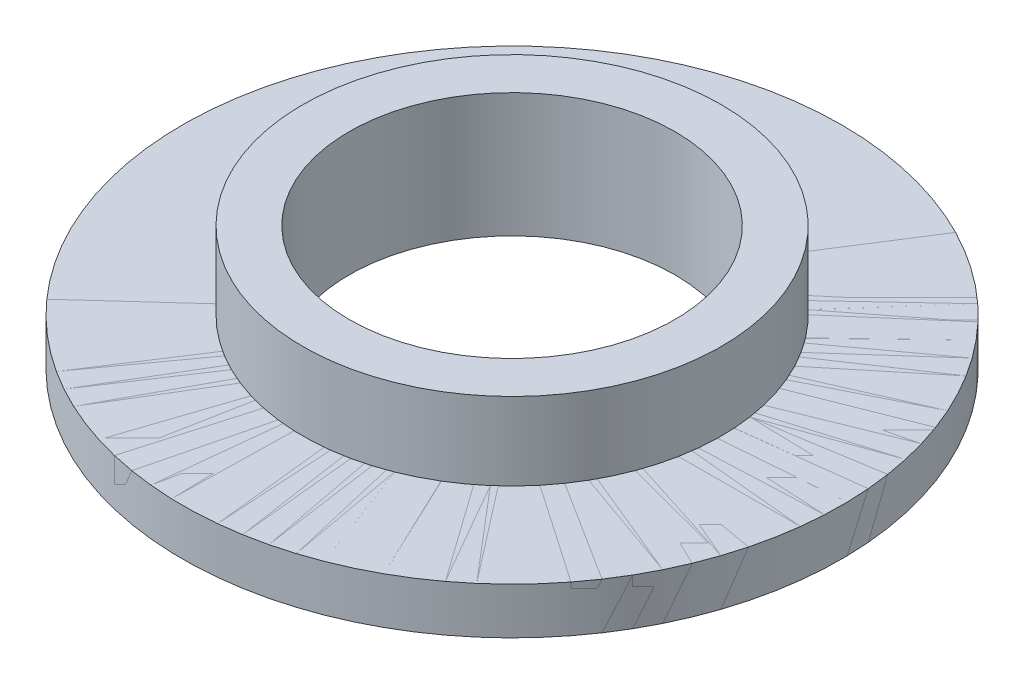
ISO-10303-21;
HEADER;
FILE_DESCRIPTION(('STEP AP214'),'2;1');
FILE_NAME('part.step','',(''),(''),'','','');
FILE_SCHEMA(('AUTOMOTIVE_DESIGN { 1 0 10303 214 1 1 1 1 }'));
ENDSEC;
DATA;
#1=APPLICATION_CONTEXT('core data for automotive mechanical design processes');
#2=APPLICATION_PROTOCOL_DEFINITION('international standard','automotive_design',2000,#1);
#3=PRODUCT_CONTEXT('',#1,'mechanical');
#4=PRODUCT('Part','Part','',(#3));
#5=PRODUCT_RELATED_PRODUCT_CATEGORY('part','',(#4));
#6=PRODUCT_DEFINITION_FORMATION('','',#4);
#7=PRODUCT_DEFINITION_CONTEXT('part definition',#1,'design');
#8=PRODUCT_DEFINITION('design','',#6,#7);
#9=PRODUCT_DEFINITION_SHAPE('','',#8);
#10=(LENGTH_UNIT() NAMED_UNIT(*) SI_UNIT(.MILLI.,.METRE.));
#11=(NAMED_UNIT(*) PLANE_ANGLE_UNIT() SI_UNIT($,.RADIAN.));
#12=(NAMED_UNIT(*) SI_UNIT($,.STERADIAN.) SOLID_ANGLE_UNIT());
#13=UNCERTAINTY_MEASURE_WITH_UNIT(LENGTH_MEASURE(1.E-05),#10,'distance_accuracy_value','');
#14=(GEOMETRIC_REPRESENTATION_CONTEXT(3) GLOBAL_UNCERTAINTY_ASSIGNED_CONTEXT((#13)) GLOBAL_UNIT_ASSIGNED_CONTEXT((#10,
#11,#12)) REPRESENTATION_CONTEXT('',''));
#15=CARTESIAN_POINT('',(0.,0.,0.));
#16=DIRECTION('',(0.,0.,1.));
#17=DIRECTION('',(1.,0.,0.));
#18=AXIS2_PLACEMENT_3D('',#15,#16,#17);
#19=CARTESIAN_POINT('',(0.,0.,0.));
#20=DIRECTION('',(0.,1.,0.));
#21=DIRECTION('',(0.,0.,1.));
#22=AXIS2_PLACEMENT_3D('',#19,#20,#21);
#23=PLANE('',#22);
#24=CARTESIAN_POINT('',(0.,0.,0.));
#25=DIRECTION('',(0.,-1.,0.));
#26=DIRECTION('',(0.,0.,-1.));
#27=AXIS2_PLACEMENT_3D('',#24,#25,#26);
#28=CIRCLE('',#27,2.667);
#29=CARTESIAN_POINT('',(0.,0.,-2.667));
#30=VERTEX_POINT('',#29);
#31=EDGE_CURVE('E11',#30,#30,#28,.T.);
#32=ORIENTED_EDGE('',*,*,#31,.F.);
#33=EDGE_LOOP('',(#32));
#34=FACE_BOUND('',#33,.T.);
#35=CARTESIAN_POINT('',(0.,0.,0.));
#36=DIRECTION('',(0.,-1.,0.));
#37=DIRECTION('',(0.,0.,-1.));
#38=AXIS2_PLACEMENT_3D('',#35,#36,#37);
#39=CIRCLE('',#38,5.3975);
#40=CARTESIAN_POINT('',(0.,0.,-5.3975));
#41=VERTEX_POINT('',#40);
#42=EDGE_CURVE('E78',#41,#41,#39,.T.);
#43=ORIENTED_EDGE('',*,*,#42,.T.);
#44=EDGE_LOOP('',(#43));
#45=FACE_BOUND('',#44,.T.);
#46=ADVANCED_FACE('F61',(#34,#45),#23,.F.);
#47=CARTESIAN_POINT('',(0.,0.,0.));
#48=DIRECTION('',(0.,-1.,0.));
#49=DIRECTION('',(0.,0.,-1.));
#50=AXIS2_PLACEMENT_3D('',#47,#48,#49);
#51=CYLINDRICAL_SURFACE('',#50,2.667);
#52=CARTESIAN_POINT('',(0.,0.762,0.));
#53=DIRECTION('',(0.,-1.,0.));
#54=DIRECTION('',(0.,0.,-1.));
#55=AXIS2_PLACEMENT_3D('',#52,#53,#54);
#56=CIRCLE('',#55,2.667);
#57=CARTESIAN_POINT('',(0.,0.762,-2.667));
#58=VERTEX_POINT('',#57);
#59=EDGE_CURVE('E68',#58,#58,#56,.T.);
#60=ORIENTED_EDGE('',*,*,#59,.F.);
#61=EDGE_LOOP('',(#60));
#62=FACE_BOUND('',#61,.T.);
#63=ORIENTED_EDGE('',*,*,#31,.T.);
#64=EDGE_LOOP('',(#63));
#65=FACE_BOUND('',#64,.T.);
#66=ADVANCED_FACE('F94',(#62,#65),#51,.F.);
#67=CARTESIAN_POINT('',(0.,0.762,0.));
#68=DIRECTION('',(0.,1.,0.));
#69=DIRECTION('',(0.,0.,1.));
#70=AXIS2_PLACEMENT_3D('',#67,#68,#69);
#71=PLANE('',#70);
#72=ORIENTED_EDGE('',*,*,#59,.T.);
#73=EDGE_LOOP('',(#72));
#74=FACE_BOUND('',#73,.T.);
#75=CARTESIAN_POINT('',(0.,0.762,0.));
#76=DIRECTION('',(0.,-1.,0.));
#77=DIRECTION('',(0.,0.,-1.));
#78=AXIS2_PLACEMENT_3D('',#75,#76,#77);
#79=CIRCLE('',#78,5.3975);
#80=CARTESIAN_POINT('',(0.,0.762,-5.3975));
#81=VERTEX_POINT('',#80);
#82=EDGE_CURVE('E73',#81,#81,#79,.T.);
#83=ORIENTED_EDGE('',*,*,#82,.F.);
#84=EDGE_LOOP('',(#83));
#85=FACE_BOUND('',#84,.T.);
#86=ADVANCED_FACE('F88',(#74,#85),#71,.T.);
#87=CARTESIAN_POINT('',(0.,0.,0.));
#88=DIRECTION('',(0.,-1.,0.));
#89=DIRECTION('',(0.,0.,-1.));
#90=AXIS2_PLACEMENT_3D('',#87,#88,#89);
#91=CYLINDRICAL_SURFACE('',#90,5.3975);
#92=ORIENTED_EDGE('',*,*,#82,.T.);
#93=EDGE_LOOP('',(#92));
#94=FACE_BOUND('',#93,.T.);
#95=ORIENTED_EDGE('',*,*,#42,.F.);
#96=EDGE_LOOP('',(#95));
#97=FACE_BOUND('',#96,.T.);
#98=ADVANCED_FACE('F86',(#94,#97),#91,.T.);
#99=CLOSED_SHELL('',(#46,#66,#86,#98));
#100=MANIFOLD_SOLID_BREP('B2',#99);
#101=CARTESIAN_POINT('',(-5.3975,0.,0.));
#102=DIRECTION('',(0.,1.,0.));
#103=DIRECTION('',(0.,0.,1.));
#104=AXIS2_PLACEMENT_3D('',#101,#102,#103);
#105=PLANE('',#104);
#106=CARTESIAN_POINT('',(0.,0.,0.));
#107=DIRECTION('',(0.,-1.,0.));
#108=DIRECTION('',(0.,0.,-1.));
#109=AXIS2_PLACEMENT_3D('',#106,#107,#108);
#110=CIRCLE('',#109,2.667);
#111=CARTESIAN_POINT('',(0.,0.,-2.667));
#112=VERTEX_POINT('',#111);
#113=EDGE_CURVE('E60',#112,#112,#110,.T.);
#114=ORIENTED_EDGE('',*,*,#113,.F.);
#115=EDGE_LOOP('',(#114));
#116=FACE_BOUND('',#115,.T.);
#117=CARTESIAN_POINT('',(0.,0.,0.));
#118=DIRECTION('',(0.,-1.,0.));
#119=DIRECTION('',(0.,0.,-1.));
#120=AXIS2_PLACEMENT_3D('',#117,#118,#119);
#121=CIRCLE('',#120,5.3975);
#122=CARTESIAN_POINT('',(0.,0.,-5.3975));
#123=VERTEX_POINT('',#122);
#124=EDGE_CURVE('E155',#123,#123,#121,.T.);
#125=ORIENTED_EDGE('',*,*,#124,.T.);
#126=EDGE_LOOP('',(#125));
#127=FACE_BOUND('',#126,.T.);
#128=ADVANCED_FACE('F127',(#116,#127),#105,.F.);
#129=CARTESIAN_POINT('',(0.,0.,0.));
#130=DIRECTION('',(0.,-1.,0.));
#131=DIRECTION('',(0.,0.,-1.));
#132=AXIS2_PLACEMENT_3D('',#129,#130,#131);
#133=CYLINDRICAL_SURFACE('',#132,2.667);
#134=CARTESIAN_POINT('',(0.,2.032,0.));
#135=DIRECTION('',(0.,-1.,0.));
#136=DIRECTION('',(0.,0.,-1.));
#137=AXIS2_PLACEMENT_3D('',#134,#135,#136);
#138=CIRCLE('',#137,2.667);
#139=CARTESIAN_POINT('',(0.,2.032,-2.667));
#140=VERTEX_POINT('',#139);
#141=EDGE_CURVE('E134',#140,#140,#138,.T.);
#142=ORIENTED_EDGE('',*,*,#141,.F.);
#143=EDGE_LOOP('',(#142));
#144=FACE_BOUND('',#143,.T.);
#145=ORIENTED_EDGE('',*,*,#113,.T.);
#146=EDGE_LOOP('',(#145));
#147=FACE_BOUND('',#146,.T.);
#148=ADVANCED_FACE('F180',(#144,#147),#133,.F.);
#149=CARTESIAN_POINT('',(-2.667,2.032,0.));
#150=DIRECTION('',(0.,-1.,0.));
#151=DIRECTION('',(0.,0.,-1.));
#152=AXIS2_PLACEMENT_3D('',#149,#150,#151);
#153=PLANE('',#152);
#154=CARTESIAN_POINT('',(0.,2.032,0.));
#155=DIRECTION('',(0.,-1.,0.));
#156=DIRECTION('',(0.,0.,-1.));
#157=AXIS2_PLACEMENT_3D('',#154,#155,#156);
#158=CIRCLE('',#157,3.429);
#159=CARTESIAN_POINT('',(0.,2.032,-3.429));
#160=VERTEX_POINT('',#159);
#161=EDGE_CURVE('E141',#160,#160,#158,.T.);
#162=ORIENTED_EDGE('',*,*,#161,.F.);
#163=EDGE_LOOP('',(#162));
#164=FACE_BOUND('',#163,.T.);
#165=ORIENTED_EDGE('',*,*,#141,.T.);
#166=EDGE_LOOP('',(#165));
#167=FACE_BOUND('',#166,.T.);
#168=ADVANCED_FACE('F175',(#164,#167),#153,.F.);
#169=CARTESIAN_POINT('',(0.,0.,0.));
#170=DIRECTION('',(0.,-1.,0.));
#171=DIRECTION('',(0.,0.,-1.));
#172=AXIS2_PLACEMENT_3D('',#169,#170,#171);
#173=CYLINDRICAL_SURFACE('',#172,3.429);
#174=CARTESIAN_POINT('',(0.,0.762,0.));
#175=DIRECTION('',(0.,-1.,0.));
#176=DIRECTION('',(0.,0.,-1.));
#177=AXIS2_PLACEMENT_3D('',#174,#175,#176);
#178=CIRCLE('',#177,3.429);
#179=CARTESIAN_POINT('',(0.,0.762,-3.429));
#180=VERTEX_POINT('',#179);
#181=EDGE_CURVE('E147',#180,#180,#178,.T.);
#182=ORIENTED_EDGE('',*,*,#181,.F.);
#183=EDGE_LOOP('',(#182));
#184=FACE_BOUND('',#183,.T.);
#185=ORIENTED_EDGE('',*,*,#161,.T.);
#186=EDGE_LOOP('',(#185));
#187=FACE_BOUND('',#186,.T.);
#188=ADVANCED_FACE('F169',(#184,#187),#173,.T.);
#189=CARTESIAN_POINT('',(-3.429,0.762,0.));
#190=DIRECTION('',(0.,-1.,0.));
#191=DIRECTION('',(0.,0.,-1.));
#192=AXIS2_PLACEMENT_3D('',#189,#190,#191);
#193=PLANE('',#192);
#194=CARTESIAN_POINT('',(0.,0.762,0.));
#195=DIRECTION('',(0.,-1.,0.));
#196=DIRECTION('',(0.,0.,-1.));
#197=AXIS2_PLACEMENT_3D('',#194,#195,#196);
#198=CIRCLE('',#197,5.3975);
#199=CARTESIAN_POINT('',(0.,0.762,-5.3975));
#200=VERTEX_POINT('',#199);
#201=EDGE_CURVE('E152',#200,#200,#198,.T.);
#202=ORIENTED_EDGE('',*,*,#201,.F.);
#203=EDGE_LOOP('',(#202));
#204=FACE_BOUND('',#203,.T.);
#205=ORIENTED_EDGE('',*,*,#181,.T.);
#206=EDGE_LOOP('',(#205));
#207=FACE_BOUND('',#206,.T.);
#208=ADVANCED_FACE('F163',(#204,#207),#193,.F.);
#209=CARTESIAN_POINT('',(0.,0.,0.));
#210=DIRECTION('',(0.,-1.,0.));
#211=DIRECTION('',(0.,0.,-1.));
#212=AXIS2_PLACEMENT_3D('',#209,#210,#211);
#213=CYLINDRICAL_SURFACE('',#212,5.3975);
#214=ORIENTED_EDGE('',*,*,#124,.F.);
#215=EDGE_LOOP('',(#214));
#216=FACE_BOUND('',#215,.T.);
#217=ORIENTED_EDGE('',*,*,#201,.T.);
#218=EDGE_LOOP('',(#217));
#219=FACE_BOUND('',#218,.T.);
#220=ADVANCED_FACE('F160',(#216,#219),#213,.T.);
#221=CLOSED_SHELL('',(#128,#148,#168,#188,#208,#220));
#222=MANIFOLD_SOLID_BREP('B6_NOT_SHOWN',#221);
#223=ADVANCED_BREP_SHAPE_REPRESENTATION('',(#18,#100,#222),#14);
#224=SHAPE_DEFINITION_REPRESENTATION(#9,#223);
ENDSEC;
END-ISO-10303-21;
